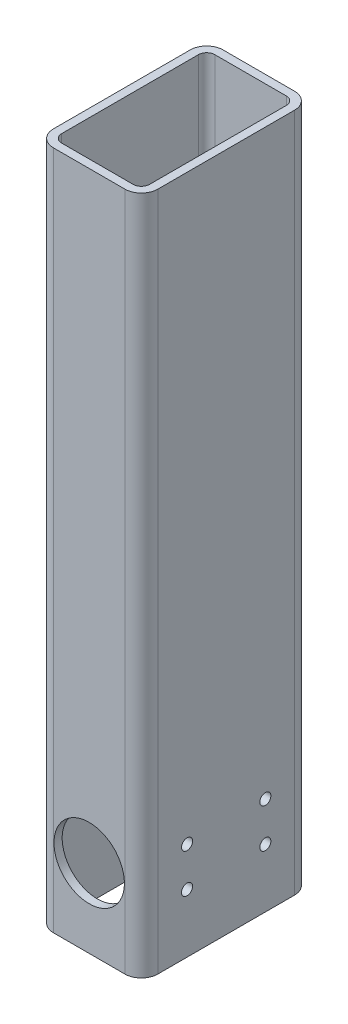
ISO-10303-21;
HEADER;
FILE_DESCRIPTION(('STEP AP214'),'2;1');
FILE_NAME('part.step','',(''),(''),'','','');
FILE_SCHEMA(('AUTOMOTIVE_DESIGN { 1 0 10303 214 1 1 1 1 }'));
ENDSEC;
DATA;
#1=APPLICATION_CONTEXT('core data for automotive mechanical design processes');
#2=APPLICATION_PROTOCOL_DEFINITION('international standard','automotive_design',2000,#1);
#3=PRODUCT_CONTEXT('',#1,'mechanical');
#4=PRODUCT('Part','Part','',(#3));
#5=PRODUCT_RELATED_PRODUCT_CATEGORY('part','',(#4));
#6=PRODUCT_DEFINITION_FORMATION('','',#4);
#7=PRODUCT_DEFINITION_CONTEXT('part definition',#1,'design');
#8=PRODUCT_DEFINITION('design','',#6,#7);
#9=PRODUCT_DEFINITION_SHAPE('','',#8);
#10=(LENGTH_UNIT() NAMED_UNIT(*) SI_UNIT(.MILLI.,.METRE.));
#11=(NAMED_UNIT(*) PLANE_ANGLE_UNIT() SI_UNIT($,.RADIAN.));
#12=(NAMED_UNIT(*) SI_UNIT($,.STERADIAN.) SOLID_ANGLE_UNIT());
#13=UNCERTAINTY_MEASURE_WITH_UNIT(LENGTH_MEASURE(1.E-05),#10,'distance_accuracy_value','');
#14=(GEOMETRIC_REPRESENTATION_CONTEXT(3) GLOBAL_UNCERTAINTY_ASSIGNED_CONTEXT((#13)) GLOBAL_UNIT_ASSIGNED_CONTEXT((#10,
#11,#12)) REPRESENTATION_CONTEXT('',''));
#15=CARTESIAN_POINT('',(0.,0.,0.));
#16=DIRECTION('',(0.,0.,1.));
#17=DIRECTION('',(1.,0.,0.));
#18=AXIS2_PLACEMENT_3D('',#15,#16,#17);
#19=CARTESIAN_POINT('',(40.,15.,-30.));
#20=DIRECTION('',(1.,0.,0.));
#21=DIRECTION('',(0.,0.,-1.));
#22=AXIS2_PLACEMENT_3D('',#19,#20,#21);
#23=CYLINDRICAL_SURFACE('',#22,4.25);
#24=CARTESIAN_POINT('',(40.,15.,-30.));
#25=DIRECTION('',(1.,0.,0.));
#26=DIRECTION('',(0.,0.,-1.));
#27=AXIS2_PLACEMENT_3D('',#24,#25,#26);
#28=CIRCLE('',#27,4.25);
#29=CARTESIAN_POINT('',(40.,15.,-34.25));
#30=VERTEX_POINT('',#29);
#31=EDGE_CURVE('E58',#30,#30,#28,.T.);
#32=ORIENTED_EDGE('',*,*,#31,.T.);
#33=EDGE_LOOP('',(#32));
#34=FACE_BOUND('',#33,.T.);
#35=CARTESIAN_POINT('',(33.7,15.,-30.));
#36=DIRECTION('',(1.,0.,0.));
#37=DIRECTION('',(0.,0.,-1.));
#38=AXIS2_PLACEMENT_3D('',#35,#36,#37);
#39=CIRCLE('',#38,4.25);
#40=CARTESIAN_POINT('',(33.7,15.,-34.25));
#41=VERTEX_POINT('',#40);
#42=EDGE_CURVE('E11',#41,#41,#39,.T.);
#43=ORIENTED_EDGE('',*,*,#42,.F.);
#44=EDGE_LOOP('',(#43));
#45=FACE_BOUND('',#44,.T.);
#46=ADVANCED_FACE('F51',(#34,#45),#23,.F.);
#47=CARTESIAN_POINT('',(40.,15.,30.));
#48=DIRECTION('',(1.,0.,0.));
#49=DIRECTION('',(0.,0.,-1.));
#50=AXIS2_PLACEMENT_3D('',#47,#48,#49);
#51=CYLINDRICAL_SURFACE('',#50,4.25);
#52=CARTESIAN_POINT('',(40.,15.,30.));
#53=DIRECTION('',(1.,0.,0.));
#54=DIRECTION('',(0.,0.,-1.));
#55=AXIS2_PLACEMENT_3D('',#52,#53,#54);
#56=CIRCLE('',#55,4.25);
#57=CARTESIAN_POINT('',(40.,15.,25.75));
#58=VERTEX_POINT('',#57);
#59=EDGE_CURVE('E288',#58,#58,#56,.T.);
#60=ORIENTED_EDGE('',*,*,#59,.T.);
#61=EDGE_LOOP('',(#60));
#62=FACE_BOUND('',#61,.T.);
#63=CARTESIAN_POINT('',(33.7,15.,30.));
#64=DIRECTION('',(1.,0.,0.));
#65=DIRECTION('',(0.,0.,-1.));
#66=AXIS2_PLACEMENT_3D('',#63,#64,#65);
#67=CIRCLE('',#66,4.25);
#68=CARTESIAN_POINT('',(33.7,15.,25.75));
#69=VERTEX_POINT('',#68);
#70=EDGE_CURVE('E313',#69,#69,#67,.T.);
#71=ORIENTED_EDGE('',*,*,#70,.F.);
#72=EDGE_LOOP('',(#71));
#73=FACE_BOUND('',#72,.T.);
#74=ADVANCED_FACE('F334',(#62,#73),#51,.F.);
#75=CARTESIAN_POINT('',(27.4,-60.,-52.4));
#76=DIRECTION('',(0.,1.,0.));
#77=DIRECTION('',(0.,0.,1.));
#78=AXIS2_PLACEMENT_3D('',#75,#76,#77);
#79=CYLINDRICAL_SURFACE('',#78,12.6);
#80=DIRECTION('',(0.,1.,0.));
#81=VECTOR('',#80,1.);
#82=CARTESIAN_POINT('',(27.4,-60.,-65.));
#83=LINE('',#82,#81);
#84=CARTESIAN_POINT('',(27.4,-60.,-65.));
#85=VERTEX_POINT('',#84);
#86=CARTESIAN_POINT('',(27.4,461.,-65.));
#87=VERTEX_POINT('',#86);
#88=EDGE_CURVE('E286',#85,#87,#83,.T.);
#89=ORIENTED_EDGE('',*,*,#88,.T.);
#90=CARTESIAN_POINT('',(27.4,461.,-52.4));
#91=DIRECTION('',(0.,1.,0.));
#92=DIRECTION('',(0.,0.,1.));
#93=AXIS2_PLACEMENT_3D('',#90,#91,#92);
#94=CIRCLE('',#93,12.6);
#95=CARTESIAN_POINT('',(40.,461.,-52.4));
#96=VERTEX_POINT('',#95);
#97=EDGE_CURVE('E209',#96,#87,#94,.T.);
#98=ORIENTED_EDGE('',*,*,#97,.F.);
#99=DIRECTION('',(0.,1.,0.));
#100=VECTOR('',#99,1.);
#101=CARTESIAN_POINT('',(40.,-60.,-52.4));
#102=LINE('',#101,#100);
#103=CARTESIAN_POINT('',(40.,-60.,-52.4));
#104=VERTEX_POINT('',#103);
#105=EDGE_CURVE('E73',#104,#96,#102,.T.);
#106=ORIENTED_EDGE('',*,*,#105,.F.);
#107=CARTESIAN_POINT('',(27.4,-60.,-52.4));
#108=DIRECTION('',(0.,1.,0.));
#109=DIRECTION('',(0.,0.,1.));
#110=AXIS2_PLACEMENT_3D('',#107,#108,#109);
#111=CIRCLE('',#110,12.6);
#112=EDGE_CURVE('E252',#104,#85,#111,.T.);
#113=ORIENTED_EDGE('',*,*,#112,.T.);
#114=EDGE_LOOP('',(#89,#98,#106,#113));
#115=FACE_BOUND('',#114,.T.);
#116=ADVANCED_FACE('F323',(#115),#79,.T.);
#117=CARTESIAN_POINT('',(40.,-60.,-52.4));
#118=DIRECTION('',(1.,0.,0.));
#119=DIRECTION('',(0.,0.,-1.));
#120=AXIS2_PLACEMENT_3D('',#117,#118,#119);
#121=PLANE('',#120);
#122=CARTESIAN_POINT('',(40.,-15.,-30.));
#123=DIRECTION('',(1.,0.,0.));
#124=DIRECTION('',(0.,0.,-1.));
#125=AXIS2_PLACEMENT_3D('',#122,#123,#124);
#126=CIRCLE('',#125,4.25);
#127=CARTESIAN_POINT('',(40.,-15.,-34.25));
#128=VERTEX_POINT('',#127);
#129=EDGE_CURVE('E441',#128,#128,#126,.T.);
#130=ORIENTED_EDGE('',*,*,#129,.F.);
#131=EDGE_LOOP('',(#130));
#132=FACE_BOUND('',#131,.T.);
#133=CARTESIAN_POINT('',(40.,-15.,30.));
#134=DIRECTION('',(1.,0.,0.));
#135=DIRECTION('',(0.,0.,-1.));
#136=AXIS2_PLACEMENT_3D('',#133,#134,#135);
#137=CIRCLE('',#136,4.25);
#138=CARTESIAN_POINT('',(40.,-15.,25.75));
#139=VERTEX_POINT('',#138);
#140=EDGE_CURVE('E310',#139,#139,#137,.T.);
#141=ORIENTED_EDGE('',*,*,#140,.F.);
#142=EDGE_LOOP('',(#141));
#143=FACE_BOUND('',#142,.T.);
#144=ORIENTED_EDGE('',*,*,#105,.T.);
#145=DIRECTION('',(0.,0.,-1.));
#146=VECTOR('',#145,1.);
#147=CARTESIAN_POINT('',(40.,461.,-52.4));
#148=LINE('',#147,#146);
#149=CARTESIAN_POINT('',(40.,461.,52.4));
#150=VERTEX_POINT('',#149);
#151=EDGE_CURVE('E230',#150,#96,#148,.T.);
#152=ORIENTED_EDGE('',*,*,#151,.F.);
#153=DIRECTION('',(0.,1.,0.));
#154=VECTOR('',#153,1.);
#155=CARTESIAN_POINT('',(40.,-60.,52.4));
#156=LINE('',#155,#154);
#157=CARTESIAN_POINT('',(40.,-60.,52.4));
#158=VERTEX_POINT('',#157);
#159=EDGE_CURVE('E289',#158,#150,#156,.T.);
#160=ORIENTED_EDGE('',*,*,#159,.F.);
#161=DIRECTION('',(0.,0.,-1.));
#162=VECTOR('',#161,1.);
#163=CARTESIAN_POINT('',(40.,-60.,-52.4));
#164=LINE('',#163,#162);
#165=EDGE_CURVE('E283',#158,#104,#164,.T.);
#166=ORIENTED_EDGE('',*,*,#165,.T.);
#167=EDGE_LOOP('',(#144,#152,#160,#166));
#168=FACE_BOUND('',#167,.T.);
#169=ORIENTED_EDGE('',*,*,#59,.F.);
#170=EDGE_LOOP('',(#169));
#171=FACE_BOUND('',#170,.T.);
#172=ORIENTED_EDGE('',*,*,#31,.F.);
#173=EDGE_LOOP('',(#172));
#174=FACE_BOUND('',#173,.T.);
#175=ADVANCED_FACE('F320',(#132,#143,#168,#171,#174),#121,.T.);
#176=CARTESIAN_POINT('',(27.4,-60.,52.4));
#177=DIRECTION('',(0.,1.,0.));
#178=DIRECTION('',(0.,0.,1.));
#179=AXIS2_PLACEMENT_3D('',#176,#177,#178);
#180=CYLINDRICAL_SURFACE('',#179,12.6);
#181=ORIENTED_EDGE('',*,*,#159,.T.);
#182=CARTESIAN_POINT('',(27.4,461.,52.4));
#183=DIRECTION('',(0.,1.,0.));
#184=DIRECTION('',(0.,0.,1.));
#185=AXIS2_PLACEMENT_3D('',#182,#183,#184);
#186=CIRCLE('',#185,12.6);
#187=CARTESIAN_POINT('',(27.4,461.,65.));
#188=VERTEX_POINT('',#187);
#189=EDGE_CURVE('E227',#188,#150,#186,.T.);
#190=ORIENTED_EDGE('',*,*,#189,.F.);
#191=DIRECTION('',(0.,1.,0.));
#192=VECTOR('',#191,1.);
#193=CARTESIAN_POINT('',(27.4,-60.,65.));
#194=LINE('',#193,#192);
#195=CARTESIAN_POINT('',(27.4,-60.,65.));
#196=VERTEX_POINT('',#195);
#197=EDGE_CURVE('E291',#196,#188,#194,.T.);
#198=ORIENTED_EDGE('',*,*,#197,.F.);
#199=CARTESIAN_POINT('',(27.4,-60.,52.4));
#200=DIRECTION('',(0.,1.,0.));
#201=DIRECTION('',(0.,0.,1.));
#202=AXIS2_PLACEMENT_3D('',#199,#200,#201);
#203=CIRCLE('',#202,12.6);
#204=EDGE_CURVE('E280',#196,#158,#203,.T.);
#205=ORIENTED_EDGE('',*,*,#204,.T.);
#206=EDGE_LOOP('',(#181,#190,#198,#205));
#207=FACE_BOUND('',#206,.T.);
#208=ADVANCED_FACE('F322',(#207),#180,.T.);
#209=CARTESIAN_POINT('',(-27.4,-60.,65.));
#210=DIRECTION('',(0.,0.,1.));
#211=DIRECTION('',(1.,0.,0.));
#212=AXIS2_PLACEMENT_3D('',#209,#210,#211);
#213=PLANE('',#212);
#214=CARTESIAN_POINT('',(0.,0.,65.));
#215=DIRECTION('',(0.,0.,1.));
#216=DIRECTION('',(1.,0.,0.));
#217=AXIS2_PLACEMENT_3D('',#214,#215,#216);
#218=CIRCLE('',#217,27.);
#219=CARTESIAN_POINT('',(27.,0.,65.));
#220=VERTEX_POINT('',#219);
#221=EDGE_CURVE('E309',#220,#220,#218,.T.);
#222=ORIENTED_EDGE('',*,*,#221,.F.);
#223=EDGE_LOOP('',(#222));
#224=FACE_BOUND('',#223,.T.);
#225=ORIENTED_EDGE('',*,*,#197,.T.);
#226=DIRECTION('',(1.,0.,0.));
#227=VECTOR('',#226,1.);
#228=CARTESIAN_POINT('',(-27.4,461.,65.));
#229=LINE('',#228,#227);
#230=CARTESIAN_POINT('',(-27.4,461.,65.));
#231=VERTEX_POINT('',#230);
#232=EDGE_CURVE('E224',#231,#188,#229,.T.);
#233=ORIENTED_EDGE('',*,*,#232,.F.);
#234=DIRECTION('',(0.,1.,0.));
#235=VECTOR('',#234,1.);
#236=CARTESIAN_POINT('',(-27.4,-60.,65.));
#237=LINE('',#236,#235);
#238=CARTESIAN_POINT('',(-27.4,-60.,65.));
#239=VERTEX_POINT('',#238);
#240=EDGE_CURVE('E293',#239,#231,#237,.T.);
#241=ORIENTED_EDGE('',*,*,#240,.F.);
#242=DIRECTION('',(1.,0.,0.));
#243=VECTOR('',#242,1.);
#244=CARTESIAN_POINT('',(-27.4,-60.,65.));
#245=LINE('',#244,#243);
#246=EDGE_CURVE('E277',#239,#196,#245,.T.);
#247=ORIENTED_EDGE('',*,*,#246,.T.);
#248=EDGE_LOOP('',(#225,#233,#241,#247));
#249=FACE_BOUND('',#248,.T.);
#250=ADVANCED_FACE('F330',(#224,#249),#213,.T.);
#251=CARTESIAN_POINT('',(-27.4,-60.,52.4));
#252=DIRECTION('',(0.,1.,0.));
#253=DIRECTION('',(0.,0.,1.));
#254=AXIS2_PLACEMENT_3D('',#251,#252,#253);
#255=CYLINDRICAL_SURFACE('',#254,12.6);
#256=ORIENTED_EDGE('',*,*,#240,.T.);
#257=CARTESIAN_POINT('',(-27.4,461.,52.4));
#258=DIRECTION('',(0.,1.,0.));
#259=DIRECTION('',(0.,0.,1.));
#260=AXIS2_PLACEMENT_3D('',#257,#258,#259);
#261=CIRCLE('',#260,12.6);
#262=CARTESIAN_POINT('',(-40.,461.,52.4));
#263=VERTEX_POINT('',#262);
#264=EDGE_CURVE('E221',#263,#231,#261,.T.);
#265=ORIENTED_EDGE('',*,*,#264,.F.);
#266=DIRECTION('',(0.,1.,0.));
#267=VECTOR('',#266,1.);
#268=CARTESIAN_POINT('',(-40.,-60.,52.4));
#269=LINE('',#268,#267);
#270=CARTESIAN_POINT('',(-40.,-60.,52.4));
#271=VERTEX_POINT('',#270);
#272=EDGE_CURVE('E295',#271,#263,#269,.T.);
#273=ORIENTED_EDGE('',*,*,#272,.F.);
#274=CARTESIAN_POINT('',(-27.4,-60.,52.4));
#275=DIRECTION('',(0.,1.,0.));
#276=DIRECTION('',(0.,0.,1.));
#277=AXIS2_PLACEMENT_3D('',#274,#275,#276);
#278=CIRCLE('',#277,12.6);
#279=EDGE_CURVE('E274',#271,#239,#278,.T.);
#280=ORIENTED_EDGE('',*,*,#279,.T.);
#281=EDGE_LOOP('',(#256,#265,#273,#280));
#282=FACE_BOUND('',#281,.T.);
#283=ADVANCED_FACE('F361',(#282),#255,.T.);
#284=CARTESIAN_POINT('',(-40.,-60.,52.4));
#285=DIRECTION('',(-1.,0.,0.));
#286=DIRECTION('',(0.,0.,1.));
#287=AXIS2_PLACEMENT_3D('',#284,#285,#286);
#288=PLANE('',#287);
#289=ORIENTED_EDGE('',*,*,#272,.T.);
#290=DIRECTION('',(0.,0.,1.));
#291=VECTOR('',#290,1.);
#292=CARTESIAN_POINT('',(-40.,461.,52.4));
#293=LINE('',#292,#291);
#294=CARTESIAN_POINT('',(-40.,461.,-52.4));
#295=VERTEX_POINT('',#294);
#296=EDGE_CURVE('E218',#295,#263,#293,.T.);
#297=ORIENTED_EDGE('',*,*,#296,.F.);
#298=DIRECTION('',(0.,1.,0.));
#299=VECTOR('',#298,1.);
#300=CARTESIAN_POINT('',(-40.,-60.,-52.4));
#301=LINE('',#300,#299);
#302=CARTESIAN_POINT('',(-40.,-60.,-52.4));
#303=VERTEX_POINT('',#302);
#304=EDGE_CURVE('E297',#303,#295,#301,.T.);
#305=ORIENTED_EDGE('',*,*,#304,.F.);
#306=DIRECTION('',(0.,0.,1.));
#307=VECTOR('',#306,1.);
#308=CARTESIAN_POINT('',(-40.,-60.,52.4));
#309=LINE('',#308,#307);
#310=EDGE_CURVE('E271',#303,#271,#309,.T.);
#311=ORIENTED_EDGE('',*,*,#310,.T.);
#312=EDGE_LOOP('',(#289,#297,#305,#311));
#313=FACE_BOUND('',#312,.T.);
#314=ADVANCED_FACE('F357',(#313),#288,.T.);
#315=CARTESIAN_POINT('',(-27.4,-60.,-52.4));
#316=DIRECTION('',(0.,1.,0.));
#317=DIRECTION('',(0.,0.,1.));
#318=AXIS2_PLACEMENT_3D('',#315,#316,#317);
#319=CYLINDRICAL_SURFACE('',#318,12.6);
#320=ORIENTED_EDGE('',*,*,#304,.T.);
#321=CARTESIAN_POINT('',(-27.4,461.,-52.4));
#322=DIRECTION('',(0.,1.,0.));
#323=DIRECTION('',(0.,0.,1.));
#324=AXIS2_PLACEMENT_3D('',#321,#322,#323);
#325=CIRCLE('',#324,12.6);
#326=CARTESIAN_POINT('',(-27.4,461.,-65.));
#327=VERTEX_POINT('',#326);
#328=EDGE_CURVE('E215',#327,#295,#325,.T.);
#329=ORIENTED_EDGE('',*,*,#328,.F.);
#330=DIRECTION('',(0.,1.,0.));
#331=VECTOR('',#330,1.);
#332=CARTESIAN_POINT('',(-27.4,-60.,-65.));
#333=LINE('',#332,#331);
#334=CARTESIAN_POINT('',(-27.4,-60.,-65.));
#335=VERTEX_POINT('',#334);
#336=EDGE_CURVE('E299',#335,#327,#333,.T.);
#337=ORIENTED_EDGE('',*,*,#336,.F.);
#338=CARTESIAN_POINT('',(-27.4,-60.,-52.4));
#339=DIRECTION('',(0.,1.,0.));
#340=DIRECTION('',(0.,0.,1.));
#341=AXIS2_PLACEMENT_3D('',#338,#339,#340);
#342=CIRCLE('',#341,12.6);
#343=EDGE_CURVE('E268',#335,#303,#342,.T.);
#344=ORIENTED_EDGE('',*,*,#343,.T.);
#345=EDGE_LOOP('',(#320,#329,#337,#344));
#346=FACE_BOUND('',#345,.T.);
#347=ADVANCED_FACE('F353',(#346),#319,.T.);
#348=CARTESIAN_POINT('',(27.4,-60.,-65.));
#349=DIRECTION('',(0.,0.,-1.));
#350=DIRECTION('',(-1.,0.,0.));
#351=AXIS2_PLACEMENT_3D('',#348,#349,#350);
#352=PLANE('',#351);
#353=CARTESIAN_POINT('',(0.,0.,-65.));
#354=DIRECTION('',(0.,0.,1.));
#355=DIRECTION('',(1.,0.,0.));
#356=AXIS2_PLACEMENT_3D('',#353,#354,#355);
#357=CIRCLE('',#356,27.);
#358=CARTESIAN_POINT('',(27.,0.,-65.));
#359=VERTEX_POINT('',#358);
#360=EDGE_CURVE('E305',#359,#359,#357,.T.);
#361=ORIENTED_EDGE('',*,*,#360,.T.);
#362=EDGE_LOOP('',(#361));
#363=FACE_BOUND('',#362,.T.);
#364=ORIENTED_EDGE('',*,*,#336,.T.);
#365=DIRECTION('',(-1.,0.,0.));
#366=VECTOR('',#365,1.);
#367=CARTESIAN_POINT('',(27.4,461.,-65.));
#368=LINE('',#367,#366);
#369=EDGE_CURVE('E212',#87,#327,#368,.T.);
#370=ORIENTED_EDGE('',*,*,#369,.F.);
#371=ORIENTED_EDGE('',*,*,#88,.F.);
#372=DIRECTION('',(-1.,0.,0.));
#373=VECTOR('',#372,1.);
#374=CARTESIAN_POINT('',(27.4,-60.,-65.));
#375=LINE('',#374,#373);
#376=EDGE_CURVE('E265',#85,#335,#375,.T.);
#377=ORIENTED_EDGE('',*,*,#376,.T.);
#378=EDGE_LOOP('',(#364,#370,#371,#377));
#379=FACE_BOUND('',#378,.T.);
#380=ADVANCED_FACE('F349',(#363,#379),#352,.T.);
#381=CARTESIAN_POINT('',(27.4,-60.,-52.4));
#382=DIRECTION('',(0.,1.,0.));
#383=DIRECTION('',(0.,0.,1.));
#384=AXIS2_PLACEMENT_3D('',#381,#382,#383);
#385=PLANE('',#384);
#386=DIRECTION('',(-1.,0.,0.));
#387=VECTOR('',#386,1.);
#388=CARTESIAN_POINT('',(27.4,-60.,-58.7));
#389=LINE('',#388,#387);
#390=CARTESIAN_POINT('',(27.4,-60.,-58.7));
#391=VERTEX_POINT('',#390);
#392=CARTESIAN_POINT('',(-27.4,-60.,-58.7));
#393=VERTEX_POINT('',#392);
#394=EDGE_CURVE('E176',#391,#393,#389,.T.);
#395=ORIENTED_EDGE('',*,*,#394,.T.);
#396=CARTESIAN_POINT('',(-27.4,-60.,-52.4));
#397=DIRECTION('',(0.,1.,0.));
#398=DIRECTION('',(0.,0.,1.));
#399=AXIS2_PLACEMENT_3D('',#396,#397,#398);
#400=CIRCLE('',#399,6.3);
#401=CARTESIAN_POINT('',(-33.7,-60.,-52.4));
#402=VERTEX_POINT('',#401);
#403=EDGE_CURVE('E233',#393,#402,#400,.T.);
#404=ORIENTED_EDGE('',*,*,#403,.T.);
#405=DIRECTION('',(0.,0.,1.));
#406=VECTOR('',#405,1.);
#407=CARTESIAN_POINT('',(-33.7,-60.,52.4));
#408=LINE('',#407,#406);
#409=CARTESIAN_POINT('',(-33.7,-60.,52.4));
#410=VERTEX_POINT('',#409);
#411=EDGE_CURVE('E171',#402,#410,#408,.T.);
#412=ORIENTED_EDGE('',*,*,#411,.T.);
#413=CARTESIAN_POINT('',(-27.4,-60.,52.4));
#414=DIRECTION('',(0.,1.,0.));
#415=DIRECTION('',(0.,0.,1.));
#416=AXIS2_PLACEMENT_3D('',#413,#414,#415);
#417=CIRCLE('',#416,6.3);
#418=CARTESIAN_POINT('',(-27.4,-60.,58.7));
#419=VERTEX_POINT('',#418);
#420=EDGE_CURVE('E65',#410,#419,#417,.T.);
#421=ORIENTED_EDGE('',*,*,#420,.T.);
#422=DIRECTION('',(1.,0.,0.));
#423=VECTOR('',#422,1.);
#424=CARTESIAN_POINT('',(-27.4,-60.,58.7));
#425=LINE('',#424,#423);
#426=CARTESIAN_POINT('',(27.4,-60.,58.7));
#427=VERTEX_POINT('',#426);
#428=EDGE_CURVE('E237',#419,#427,#425,.T.);
#429=ORIENTED_EDGE('',*,*,#428,.T.);
#430=CARTESIAN_POINT('',(27.4,-60.,52.4));
#431=DIRECTION('',(0.,1.,0.));
#432=DIRECTION('',(0.,0.,1.));
#433=AXIS2_PLACEMENT_3D('',#430,#431,#432);
#434=CIRCLE('',#433,6.3);
#435=CARTESIAN_POINT('',(33.7,-60.,52.4));
#436=VERTEX_POINT('',#435);
#437=EDGE_CURVE('E240',#427,#436,#434,.T.);
#438=ORIENTED_EDGE('',*,*,#437,.T.);
#439=DIRECTION('',(0.,0.,-1.));
#440=VECTOR('',#439,1.);
#441=CARTESIAN_POINT('',(33.7,-60.,-52.4));
#442=LINE('',#441,#440);
#443=CARTESIAN_POINT('',(33.7,-60.,-52.4));
#444=VERTEX_POINT('',#443);
#445=EDGE_CURVE('E243',#436,#444,#442,.T.);
#446=ORIENTED_EDGE('',*,*,#445,.T.);
#447=CARTESIAN_POINT('',(27.4,-60.,-52.4));
#448=DIRECTION('',(0.,1.,0.));
#449=DIRECTION('',(0.,0.,1.));
#450=AXIS2_PLACEMENT_3D('',#447,#448,#449);
#451=CIRCLE('',#450,6.3);
#452=EDGE_CURVE('E246',#444,#391,#451,.T.);
#453=ORIENTED_EDGE('',*,*,#452,.T.);
#454=EDGE_LOOP('',(#395,#404,#412,#421,#429,#438,#446,#453));
#455=FACE_BOUND('',#454,.T.);
#456=ORIENTED_EDGE('',*,*,#112,.F.);
#457=ORIENTED_EDGE('',*,*,#165,.F.);
#458=ORIENTED_EDGE('',*,*,#204,.F.);
#459=ORIENTED_EDGE('',*,*,#246,.F.);
#460=ORIENTED_EDGE('',*,*,#279,.F.);
#461=ORIENTED_EDGE('',*,*,#310,.F.);
#462=ORIENTED_EDGE('',*,*,#343,.F.);
#463=ORIENTED_EDGE('',*,*,#376,.F.);
#464=EDGE_LOOP('',(#456,#457,#458,#459,#460,#461,#462,#463));
#465=FACE_BOUND('',#464,.T.);
#466=ADVANCED_FACE('F352',(#455,#465),#385,.F.);
#467=CARTESIAN_POINT('',(-27.4,-60.,-52.4));
#468=DIRECTION('',(0.,1.,0.));
#469=DIRECTION('',(0.,0.,1.));
#470=AXIS2_PLACEMENT_3D('',#467,#468,#469);
#471=CYLINDRICAL_SURFACE('',#470,6.3);
#472=DIRECTION('',(0.,1.,0.));
#473=VECTOR('',#472,1.);
#474=CARTESIAN_POINT('',(-27.4,-60.,-58.7));
#475=LINE('',#474,#473);
#476=CARTESIAN_POINT('',(-27.4,461.,-58.7));
#477=VERTEX_POINT('',#476);
#478=EDGE_CURVE('E181',#393,#477,#475,.T.);
#479=ORIENTED_EDGE('',*,*,#478,.T.);
#480=CARTESIAN_POINT('',(-27.4,461.,-52.4));
#481=DIRECTION('',(0.,1.,0.));
#482=DIRECTION('',(0.,0.,1.));
#483=AXIS2_PLACEMENT_3D('',#480,#481,#482);
#484=CIRCLE('',#483,6.3);
#485=CARTESIAN_POINT('',(-33.7,461.,-52.4));
#486=VERTEX_POINT('',#485);
#487=EDGE_CURVE('E179',#477,#486,#484,.T.);
#488=ORIENTED_EDGE('',*,*,#487,.T.);
#489=DIRECTION('',(0.,1.,0.));
#490=VECTOR('',#489,1.);
#491=CARTESIAN_POINT('',(-33.7,-60.,-52.4));
#492=LINE('',#491,#490);
#493=EDGE_CURVE('E164',#402,#486,#492,.T.);
#494=ORIENTED_EDGE('',*,*,#493,.F.);
#495=ORIENTED_EDGE('',*,*,#403,.F.);
#496=EDGE_LOOP('',(#479,#488,#494,#495));
#497=FACE_BOUND('',#496,.T.);
#498=ADVANCED_FACE('F180',(#497),#471,.F.);
#499=CARTESIAN_POINT('',(27.4,-60.,-58.7));
#500=DIRECTION('',(0.,0.,-1.));
#501=DIRECTION('',(-1.,0.,0.));
#502=AXIS2_PLACEMENT_3D('',#499,#500,#501);
#503=PLANE('',#502);
#504=CARTESIAN_POINT('',(0.,0.,-58.7));
#505=DIRECTION('',(0.,0.,-1.));
#506=DIRECTION('',(-1.,0.,0.));
#507=AXIS2_PLACEMENT_3D('',#504,#505,#506);
#508=CIRCLE('',#507,27.);
#509=CARTESIAN_POINT('',(-27.,0.,-58.7));
#510=VERTEX_POINT('',#509);
#511=EDGE_CURVE('E185',#510,#510,#508,.T.);
#512=ORIENTED_EDGE('',*,*,#511,.T.);
#513=EDGE_LOOP('',(#512));
#514=FACE_BOUND('',#513,.T.);
#515=DIRECTION('',(0.,1.,0.));
#516=VECTOR('',#515,1.);
#517=CARTESIAN_POINT('',(27.4,-60.,-58.7));
#518=LINE('',#517,#516);
#519=CARTESIAN_POINT('',(27.4,461.,-58.7));
#520=VERTEX_POINT('',#519);
#521=EDGE_CURVE('E253',#391,#520,#518,.T.);
#522=ORIENTED_EDGE('',*,*,#521,.T.);
#523=DIRECTION('',(-1.,0.,0.));
#524=VECTOR('',#523,1.);
#525=CARTESIAN_POINT('',(27.4,461.,-58.7));
#526=LINE('',#525,#524);
#527=EDGE_CURVE('E207',#520,#477,#526,.T.);
#528=ORIENTED_EDGE('',*,*,#527,.T.);
#529=ORIENTED_EDGE('',*,*,#478,.F.);
#530=ORIENTED_EDGE('',*,*,#394,.F.);
#531=EDGE_LOOP('',(#522,#528,#529,#530));
#532=FACE_BOUND('',#531,.T.);
#533=ADVANCED_FACE('F398',(#514,#532),#503,.F.);
#534=CARTESIAN_POINT('',(27.4,-60.,-52.4));
#535=DIRECTION('',(0.,1.,0.));
#536=DIRECTION('',(0.,0.,1.));
#537=AXIS2_PLACEMENT_3D('',#534,#535,#536);
#538=CYLINDRICAL_SURFACE('',#537,6.3);
#539=DIRECTION('',(0.,1.,0.));
#540=VECTOR('',#539,1.);
#541=CARTESIAN_POINT('',(33.7,-60.,-52.4));
#542=LINE('',#541,#540);
#543=CARTESIAN_POINT('',(33.7,461.,-52.4));
#544=VERTEX_POINT('',#543);
#545=EDGE_CURVE('E255',#444,#544,#542,.T.);
#546=ORIENTED_EDGE('',*,*,#545,.T.);
#547=CARTESIAN_POINT('',(27.4,461.,-52.4));
#548=DIRECTION('',(0.,1.,0.));
#549=DIRECTION('',(0.,0.,1.));
#550=AXIS2_PLACEMENT_3D('',#547,#548,#549);
#551=CIRCLE('',#550,6.3);
#552=EDGE_CURVE('E204',#544,#520,#551,.T.);
#553=ORIENTED_EDGE('',*,*,#552,.T.);
#554=ORIENTED_EDGE('',*,*,#521,.F.);
#555=ORIENTED_EDGE('',*,*,#452,.F.);
#556=EDGE_LOOP('',(#546,#553,#554,#555));
#557=FACE_BOUND('',#556,.T.);
#558=ADVANCED_FACE('F417',(#557),#538,.F.);
#559=CARTESIAN_POINT('',(33.7,-60.,-52.4));
#560=DIRECTION('',(1.,0.,0.));
#561=DIRECTION('',(0.,0.,-1.));
#562=AXIS2_PLACEMENT_3D('',#559,#560,#561);
#563=PLANE('',#562);
#564=CARTESIAN_POINT('',(33.7,-15.,-30.));
#565=DIRECTION('',(1.,0.,0.));
#566=DIRECTION('',(0.,0.,-1.));
#567=AXIS2_PLACEMENT_3D('',#564,#565,#566);
#568=CIRCLE('',#567,4.25);
#569=CARTESIAN_POINT('',(33.7,-15.,-34.25));
#570=VERTEX_POINT('',#569);
#571=EDGE_CURVE('E444',#570,#570,#568,.T.);
#572=ORIENTED_EDGE('',*,*,#571,.T.);
#573=EDGE_LOOP('',(#572));
#574=FACE_BOUND('',#573,.T.);
#575=CARTESIAN_POINT('',(33.7,-15.,30.));
#576=DIRECTION('',(1.,0.,0.));
#577=DIRECTION('',(0.,0.,-1.));
#578=AXIS2_PLACEMENT_3D('',#575,#576,#577);
#579=CIRCLE('',#578,4.25);
#580=CARTESIAN_POINT('',(33.7,-15.,25.75));
#581=VERTEX_POINT('',#580);
#582=EDGE_CURVE('E306',#581,#581,#579,.T.);
#583=ORIENTED_EDGE('',*,*,#582,.T.);
#584=EDGE_LOOP('',(#583));
#585=FACE_BOUND('',#584,.T.);
#586=DIRECTION('',(0.,1.,0.));
#587=VECTOR('',#586,1.);
#588=CARTESIAN_POINT('',(33.7,-60.,52.4));
#589=LINE('',#588,#587);
#590=CARTESIAN_POINT('',(33.7,461.,52.4));
#591=VERTEX_POINT('',#590);
#592=EDGE_CURVE('E257',#436,#591,#589,.T.);
#593=ORIENTED_EDGE('',*,*,#592,.T.);
#594=DIRECTION('',(0.,0.,-1.));
#595=VECTOR('',#594,1.);
#596=CARTESIAN_POINT('',(33.7,461.,-52.4));
#597=LINE('',#596,#595);
#598=EDGE_CURVE('E201',#591,#544,#597,.T.);
#599=ORIENTED_EDGE('',*,*,#598,.T.);
#600=ORIENTED_EDGE('',*,*,#545,.F.);
#601=ORIENTED_EDGE('',*,*,#445,.F.);
#602=EDGE_LOOP('',(#593,#599,#600,#601));
#603=FACE_BOUND('',#602,.T.);
#604=ORIENTED_EDGE('',*,*,#70,.T.);
#605=EDGE_LOOP('',(#604));
#606=FACE_BOUND('',#605,.T.);
#607=ORIENTED_EDGE('',*,*,#42,.T.);
#608=EDGE_LOOP('',(#607));
#609=FACE_BOUND('',#608,.T.);
#610=ADVANCED_FACE('F413',(#574,#585,#603,#606,#609),#563,.F.);
#611=CARTESIAN_POINT('',(27.4,-60.,52.4));
#612=DIRECTION('',(0.,1.,0.));
#613=DIRECTION('',(0.,0.,1.));
#614=AXIS2_PLACEMENT_3D('',#611,#612,#613);
#615=CYLINDRICAL_SURFACE('',#614,6.3);
#616=DIRECTION('',(0.,1.,0.));
#617=VECTOR('',#616,1.);
#618=CARTESIAN_POINT('',(27.4,-60.,58.7));
#619=LINE('',#618,#617);
#620=CARTESIAN_POINT('',(27.4,461.,58.7));
#621=VERTEX_POINT('',#620);
#622=EDGE_CURVE('E259',#427,#621,#619,.T.);
#623=ORIENTED_EDGE('',*,*,#622,.T.);
#624=CARTESIAN_POINT('',(27.4,461.,52.4));
#625=DIRECTION('',(0.,1.,0.));
#626=DIRECTION('',(0.,0.,1.));
#627=AXIS2_PLACEMENT_3D('',#624,#625,#626);
#628=CIRCLE('',#627,6.3);
#629=EDGE_CURVE('E198',#621,#591,#628,.T.);
#630=ORIENTED_EDGE('',*,*,#629,.T.);
#631=ORIENTED_EDGE('',*,*,#592,.F.);
#632=ORIENTED_EDGE('',*,*,#437,.F.);
#633=EDGE_LOOP('',(#623,#630,#631,#632));
#634=FACE_BOUND('',#633,.T.);
#635=ADVANCED_FACE('F409',(#634),#615,.F.);
#636=CARTESIAN_POINT('',(-27.4,-60.,58.7));
#637=DIRECTION('',(0.,0.,1.));
#638=DIRECTION('',(1.,0.,0.));
#639=AXIS2_PLACEMENT_3D('',#636,#637,#638);
#640=PLANE('',#639);
#641=CARTESIAN_POINT('',(0.,0.,58.7));
#642=DIRECTION('',(0.,0.,1.));
#643=DIRECTION('',(1.,0.,0.));
#644=AXIS2_PLACEMENT_3D('',#641,#642,#643);
#645=CIRCLE('',#644,27.);
#646=CARTESIAN_POINT('',(27.,0.,58.7));
#647=VERTEX_POINT('',#646);
#648=EDGE_CURVE('E302',#647,#647,#645,.T.);
#649=ORIENTED_EDGE('',*,*,#648,.T.);
#650=EDGE_LOOP('',(#649));
#651=FACE_BOUND('',#650,.T.);
#652=DIRECTION('',(0.,1.,0.));
#653=VECTOR('',#652,1.);
#654=CARTESIAN_POINT('',(-27.4,-60.,58.7));
#655=LINE('',#654,#653);
#656=CARTESIAN_POINT('',(-27.4,461.,58.7));
#657=VERTEX_POINT('',#656);
#658=EDGE_CURVE('E261',#419,#657,#655,.T.);
#659=ORIENTED_EDGE('',*,*,#658,.T.);
#660=DIRECTION('',(1.,0.,0.));
#661=VECTOR('',#660,1.);
#662=CARTESIAN_POINT('',(-27.4,461.,58.7));
#663=LINE('',#662,#661);
#664=EDGE_CURVE('E192',#657,#621,#663,.T.);
#665=ORIENTED_EDGE('',*,*,#664,.T.);
#666=ORIENTED_EDGE('',*,*,#622,.F.);
#667=ORIENTED_EDGE('',*,*,#428,.F.);
#668=EDGE_LOOP('',(#659,#665,#666,#667));
#669=FACE_BOUND('',#668,.T.);
#670=ADVANCED_FACE('F406',(#651,#669),#640,.F.);
#671=CARTESIAN_POINT('',(-27.4,-60.,52.4));
#672=DIRECTION('',(0.,1.,0.));
#673=DIRECTION('',(0.,0.,1.));
#674=AXIS2_PLACEMENT_3D('',#671,#672,#673);
#675=CYLINDRICAL_SURFACE('',#674,6.3);
#676=DIRECTION('',(0.,1.,0.));
#677=VECTOR('',#676,1.);
#678=CARTESIAN_POINT('',(-33.7,-60.,52.4));
#679=LINE('',#678,#677);
#680=CARTESIAN_POINT('',(-33.7,461.,52.4));
#681=VERTEX_POINT('',#680);
#682=EDGE_CURVE('E175',#410,#681,#679,.T.);
#683=ORIENTED_EDGE('',*,*,#682,.T.);
#684=CARTESIAN_POINT('',(-27.4,461.,52.4));
#685=DIRECTION('',(0.,1.,0.));
#686=DIRECTION('',(0.,0.,1.));
#687=AXIS2_PLACEMENT_3D('',#684,#685,#686);
#688=CIRCLE('',#687,6.3);
#689=EDGE_CURVE('E190',#681,#657,#688,.T.);
#690=ORIENTED_EDGE('',*,*,#689,.T.);
#691=ORIENTED_EDGE('',*,*,#658,.F.);
#692=ORIENTED_EDGE('',*,*,#420,.F.);
#693=EDGE_LOOP('',(#683,#690,#691,#692));
#694=FACE_BOUND('',#693,.T.);
#695=ADVANCED_FACE('F403',(#694),#675,.F.);
#696=CARTESIAN_POINT('',(-33.7,-60.,52.4));
#697=DIRECTION('',(-1.,0.,0.));
#698=DIRECTION('',(0.,0.,1.));
#699=AXIS2_PLACEMENT_3D('',#696,#697,#698);
#700=PLANE('',#699);
#701=ORIENTED_EDGE('',*,*,#493,.T.);
#702=DIRECTION('',(0.,0.,1.));
#703=VECTOR('',#702,1.);
#704=CARTESIAN_POINT('',(-33.7,461.,52.4));
#705=LINE('',#704,#703);
#706=EDGE_CURVE('E168',#486,#681,#705,.T.);
#707=ORIENTED_EDGE('',*,*,#706,.T.);
#708=ORIENTED_EDGE('',*,*,#682,.F.);
#709=ORIENTED_EDGE('',*,*,#411,.F.);
#710=EDGE_LOOP('',(#701,#707,#708,#709));
#711=FACE_BOUND('',#710,.T.);
#712=ADVANCED_FACE('F166',(#711),#700,.F.);
#713=CARTESIAN_POINT('',(27.4,461.,-52.4));
#714=DIRECTION('',(0.,1.,0.));
#715=DIRECTION('',(0.,0.,1.));
#716=AXIS2_PLACEMENT_3D('',#713,#714,#715);
#717=PLANE('',#716);
#718=ORIENTED_EDGE('',*,*,#97,.T.);
#719=ORIENTED_EDGE('',*,*,#369,.T.);
#720=ORIENTED_EDGE('',*,*,#328,.T.);
#721=ORIENTED_EDGE('',*,*,#296,.T.);
#722=ORIENTED_EDGE('',*,*,#264,.T.);
#723=ORIENTED_EDGE('',*,*,#232,.T.);
#724=ORIENTED_EDGE('',*,*,#189,.T.);
#725=ORIENTED_EDGE('',*,*,#151,.T.);
#726=EDGE_LOOP('',(#718,#719,#720,#721,#722,#723,#724,#725));
#727=FACE_BOUND('',#726,.T.);
#728=ORIENTED_EDGE('',*,*,#706,.F.);
#729=ORIENTED_EDGE('',*,*,#487,.F.);
#730=ORIENTED_EDGE('',*,*,#527,.F.);
#731=ORIENTED_EDGE('',*,*,#552,.F.);
#732=ORIENTED_EDGE('',*,*,#598,.F.);
#733=ORIENTED_EDGE('',*,*,#629,.F.);
#734=ORIENTED_EDGE('',*,*,#664,.F.);
#735=ORIENTED_EDGE('',*,*,#689,.F.);
#736=EDGE_LOOP('',(#728,#729,#730,#731,#732,#733,#734,#735));
#737=FACE_BOUND('',#736,.T.);
#738=ADVANCED_FACE('F187',(#727,#737),#717,.T.);
#739=CARTESIAN_POINT('',(0.,0.,-65.));
#740=DIRECTION('',(0.,0.,1.));
#741=DIRECTION('',(1.,0.,0.));
#742=AXIS2_PLACEMENT_3D('',#739,#740,#741);
#743=CYLINDRICAL_SURFACE('',#742,27.);
#744=ORIENTED_EDGE('',*,*,#221,.T.);
#745=EDGE_LOOP('',(#744));
#746=FACE_BOUND('',#745,.T.);
#747=ORIENTED_EDGE('',*,*,#648,.F.);
#748=EDGE_LOOP('',(#747));
#749=FACE_BOUND('',#748,.T.);
#750=ADVANCED_FACE('F426',(#746,#749),#743,.F.);
#751=ORIENTED_EDGE('',*,*,#360,.F.);
#752=EDGE_LOOP('',(#751));
#753=FACE_BOUND('',#752,.T.);
#754=ORIENTED_EDGE('',*,*,#511,.F.);
#755=EDGE_LOOP('',(#754));
#756=FACE_BOUND('',#755,.T.);
#757=ADVANCED_FACE('F427',(#753,#756),#743,.F.);
#758=CARTESIAN_POINT('',(40.,-15.,30.));
#759=DIRECTION('',(1.,0.,0.));
#760=DIRECTION('',(0.,0.,-1.));
#761=AXIS2_PLACEMENT_3D('',#758,#759,#760);
#762=CYLINDRICAL_SURFACE('',#761,4.25);
#763=ORIENTED_EDGE('',*,*,#140,.T.);
#764=EDGE_LOOP('',(#763));
#765=FACE_BOUND('',#764,.T.);
#766=ORIENTED_EDGE('',*,*,#582,.F.);
#767=EDGE_LOOP('',(#766));
#768=FACE_BOUND('',#767,.T.);
#769=ADVANCED_FACE('F430',(#765,#768),#762,.F.);
#770=CARTESIAN_POINT('',(40.,-15.,-30.));
#771=DIRECTION('',(1.,0.,0.));
#772=DIRECTION('',(0.,0.,-1.));
#773=AXIS2_PLACEMENT_3D('',#770,#771,#772);
#774=CYLINDRICAL_SURFACE('',#773,4.25);
#775=ORIENTED_EDGE('',*,*,#129,.T.);
#776=EDGE_LOOP('',(#775));
#777=FACE_BOUND('',#776,.T.);
#778=ORIENTED_EDGE('',*,*,#571,.F.);
#779=EDGE_LOOP('',(#778));
#780=FACE_BOUND('',#779,.T.);
#781=ADVANCED_FACE('F433',(#777,#780),#774,.F.);
#782=CLOSED_SHELL('',(#46,#74,#116,#175,#208,#250,#283,#314,#347,#380,#466,#498,#533,#558,#610,
#635,#670,#695,#712,#738,#750,#757,#769,#781));
#783=MANIFOLD_SOLID_BREP('B2',#782);
#784=ADVANCED_BREP_SHAPE_REPRESENTATION('',(#18,#783),#14);
#785=SHAPE_DEFINITION_REPRESENTATION(#9,#784);
ENDSEC;
END-ISO-10303-21;
